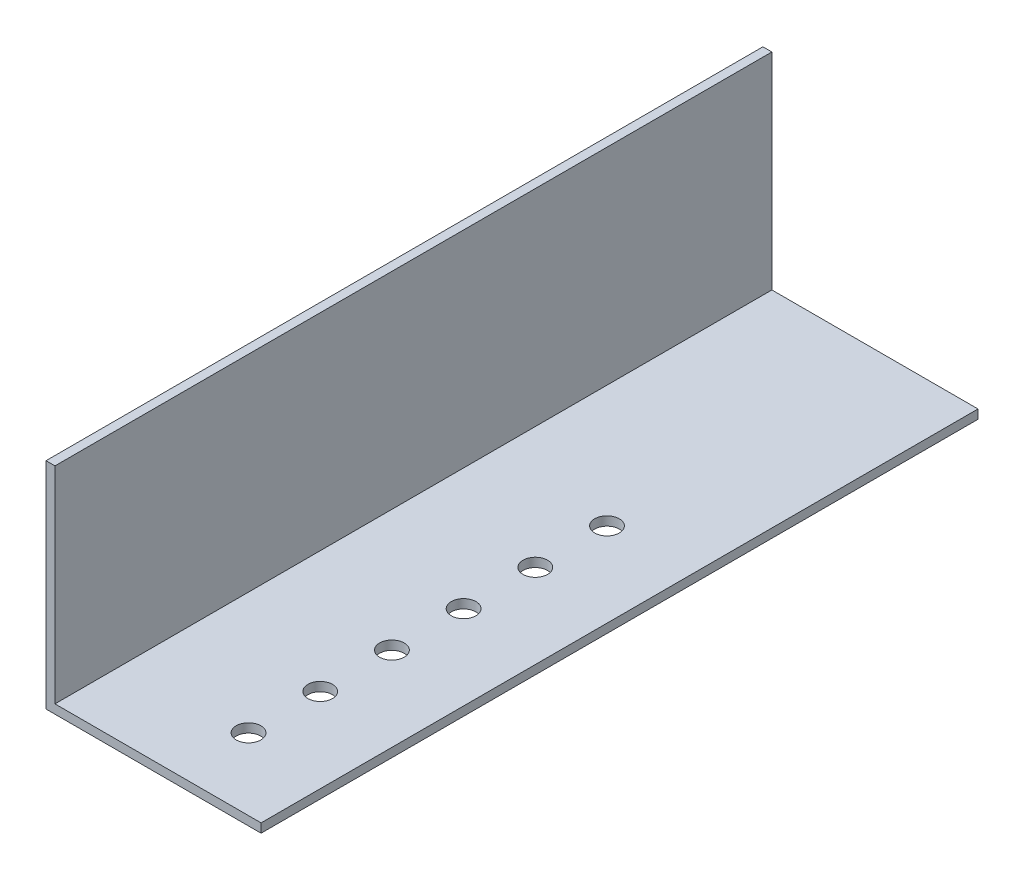
ISO-10303-21;
HEADER;
FILE_DESCRIPTION(('STEP AP214'),'2;1');
FILE_NAME('part.step','',(''),(''),'','','');
FILE_SCHEMA(('AUTOMOTIVE_DESIGN { 1 0 10303 214 1 1 1 1 }'));
ENDSEC;
DATA;
#1=APPLICATION_CONTEXT('core data for automotive mechanical design processes');
#2=APPLICATION_PROTOCOL_DEFINITION('international standard','automotive_design',2000,#1);
#3=PRODUCT_CONTEXT('',#1,'mechanical');
#4=PRODUCT('Part','Part','',(#3));
#5=PRODUCT_RELATED_PRODUCT_CATEGORY('part','',(#4));
#6=PRODUCT_DEFINITION_FORMATION('','',#4);
#7=PRODUCT_DEFINITION_CONTEXT('part definition',#1,'design');
#8=PRODUCT_DEFINITION('design','',#6,#7);
#9=PRODUCT_DEFINITION_SHAPE('','',#8);
#10=(LENGTH_UNIT() NAMED_UNIT(*) SI_UNIT(.MILLI.,.METRE.));
#11=(NAMED_UNIT(*) PLANE_ANGLE_UNIT() SI_UNIT($,.RADIAN.));
#12=(NAMED_UNIT(*) SI_UNIT($,.STERADIAN.) SOLID_ANGLE_UNIT());
#13=UNCERTAINTY_MEASURE_WITH_UNIT(LENGTH_MEASURE(1.E-05),#10,'distance_accuracy_value','');
#14=(GEOMETRIC_REPRESENTATION_CONTEXT(3) GLOBAL_UNCERTAINTY_ASSIGNED_CONTEXT((#13)) GLOBAL_UNIT_ASSIGNED_CONTEXT((#10,
#11,#12)) REPRESENTATION_CONTEXT('',''));
#15=CARTESIAN_POINT('',(0.,0.,0.));
#16=DIRECTION('',(0.,0.,1.));
#17=DIRECTION('',(1.,0.,0.));
#18=AXIS2_PLACEMENT_3D('',#15,#16,#17);
#19=CARTESIAN_POINT('',(38.1,0.,127.));
#20=DIRECTION('',(0.,1.,0.));
#21=DIRECTION('',(-1.,0.,0.));
#22=AXIS2_PLACEMENT_3D('',#19,#20,#21);
#23=PLANE('',#22);
#24=CARTESIAN_POINT('',(23.1775,0.,114.3));
#25=DIRECTION('',(0.,1.,0.));
#26=DIRECTION('',(-1.,0.,0.));
#27=AXIS2_PLACEMENT_3D('',#24,#25,#26);
#28=CIRCLE('',#27,2.18281250000001);
#29=CARTESIAN_POINT('',(20.9946875,0.,114.3));
#30=VERTEX_POINT('',#29);
#31=EDGE_CURVE('E121',#30,#30,#28,.T.);
#32=ORIENTED_EDGE('',*,*,#31,.T.);
#33=EDGE_LOOP('',(#32));
#34=FACE_BOUND('',#33,.T.);
#35=CARTESIAN_POINT('',(23.1775,0.,101.6));
#36=DIRECTION('',(0.,1.,0.));
#37=DIRECTION('',(-1.,0.,0.));
#38=AXIS2_PLACEMENT_3D('',#35,#36,#37);
#39=CIRCLE('',#38,2.18281250000001);
#40=CARTESIAN_POINT('',(20.9946875,0.,101.6));
#41=VERTEX_POINT('',#40);
#42=EDGE_CURVE('E163',#41,#41,#39,.T.);
#43=ORIENTED_EDGE('',*,*,#42,.T.);
#44=EDGE_LOOP('',(#43));
#45=FACE_BOUND('',#44,.T.);
#46=CARTESIAN_POINT('',(23.1775,0.,88.9));
#47=DIRECTION('',(0.,1.,0.));
#48=DIRECTION('',(-1.,0.,0.));
#49=AXIS2_PLACEMENT_3D('',#46,#47,#48);
#50=CIRCLE('',#49,2.18281250000001);
#51=CARTESIAN_POINT('',(20.9946875,0.,88.9));
#52=VERTEX_POINT('',#51);
#53=EDGE_CURVE('E167',#52,#52,#50,.T.);
#54=ORIENTED_EDGE('',*,*,#53,.T.);
#55=EDGE_LOOP('',(#54));
#56=FACE_BOUND('',#55,.T.);
#57=CARTESIAN_POINT('',(23.1775,0.,76.2));
#58=DIRECTION('',(0.,1.,0.));
#59=DIRECTION('',(-1.,0.,0.));
#60=AXIS2_PLACEMENT_3D('',#57,#58,#59);
#61=CIRCLE('',#60,2.18281250000001);
#62=CARTESIAN_POINT('',(20.9946875,0.,76.2));
#63=VERTEX_POINT('',#62);
#64=EDGE_CURVE('E171',#63,#63,#61,.T.);
#65=ORIENTED_EDGE('',*,*,#64,.T.);
#66=EDGE_LOOP('',(#65));
#67=FACE_BOUND('',#66,.T.);
#68=CARTESIAN_POINT('',(23.1775,0.,63.5));
#69=DIRECTION('',(0.,1.,0.));
#70=DIRECTION('',(-1.,0.,0.));
#71=AXIS2_PLACEMENT_3D('',#68,#69,#70);
#72=CIRCLE('',#71,2.18281250000001);
#73=CARTESIAN_POINT('',(20.9946875,0.,63.5));
#74=VERTEX_POINT('',#73);
#75=EDGE_CURVE('E175',#74,#74,#72,.T.);
#76=ORIENTED_EDGE('',*,*,#75,.T.);
#77=EDGE_LOOP('',(#76));
#78=FACE_BOUND('',#77,.T.);
#79=CARTESIAN_POINT('',(23.1775,0.,50.8));
#80=DIRECTION('',(0.,1.,0.));
#81=DIRECTION('',(-1.,0.,0.));
#82=AXIS2_PLACEMENT_3D('',#79,#80,#81);
#83=CIRCLE('',#82,2.1828125);
#84=CARTESIAN_POINT('',(20.9946875,0.,50.8));
#85=VERTEX_POINT('',#84);
#86=EDGE_CURVE('E178',#85,#85,#83,.T.);
#87=ORIENTED_EDGE('',*,*,#86,.T.);
#88=EDGE_LOOP('',(#87));
#89=FACE_BOUND('',#88,.T.);
#90=DIRECTION('',(1.,0.,0.));
#91=VECTOR('',#90,1.);
#92=CARTESIAN_POINT('',(38.1,0.,0.));
#93=LINE('',#92,#91);
#94=CARTESIAN_POINT('',(0.,0.,0.));
#95=VERTEX_POINT('',#94);
#96=CARTESIAN_POINT('',(38.1,0.,0.));
#97=VERTEX_POINT('',#96);
#98=EDGE_CURVE('E117',#95,#97,#93,.T.);
#99=ORIENTED_EDGE('',*,*,#98,.T.);
#100=DIRECTION('',(0.,0.,-1.));
#101=VECTOR('',#100,1.);
#102=CARTESIAN_POINT('',(38.1,0.,127.));
#103=LINE('',#102,#101);
#104=CARTESIAN_POINT('',(38.1,0.,127.));
#105=VERTEX_POINT('',#104);
#106=EDGE_CURVE('E11',#105,#97,#103,.T.);
#107=ORIENTED_EDGE('',*,*,#106,.F.);
#108=DIRECTION('',(1.,0.,0.));
#109=VECTOR('',#108,1.);
#110=CARTESIAN_POINT('',(38.1,0.,127.));
#111=LINE('',#110,#109);
#112=CARTESIAN_POINT('',(0.,0.,127.));
#113=VERTEX_POINT('',#112);
#114=EDGE_CURVE('E128',#113,#105,#111,.T.);
#115=ORIENTED_EDGE('',*,*,#114,.F.);
#116=DIRECTION('',(0.,0.,-1.));
#117=VECTOR('',#116,1.);
#118=CARTESIAN_POINT('',(0.,0.,127.));
#119=LINE('',#118,#117);
#120=EDGE_CURVE('E113',#113,#95,#119,.T.);
#121=ORIENTED_EDGE('',*,*,#120,.T.);
#122=EDGE_LOOP('',(#99,#107,#115,#121));
#123=FACE_BOUND('',#122,.T.);
#124=ADVANCED_FACE('F33',(#34,#45,#56,#67,#78,#89,#123),#23,.F.);
#125=CARTESIAN_POINT('',(38.1,1.5875,127.));
#126=DIRECTION('',(-1.,0.,0.));
#127=DIRECTION('',(0.,0.,1.));
#128=AXIS2_PLACEMENT_3D('',#125,#126,#127);
#129=PLANE('',#128);
#130=DIRECTION('',(0.,1.,0.));
#131=VECTOR('',#130,1.);
#132=CARTESIAN_POINT('',(38.1,1.5875,0.));
#133=LINE('',#132,#131);
#134=CARTESIAN_POINT('',(38.1,1.5875,0.));
#135=VERTEX_POINT('',#134);
#136=EDGE_CURVE('E120',#97,#135,#133,.T.);
#137=ORIENTED_EDGE('',*,*,#136,.T.);
#138=DIRECTION('',(0.,0.,-1.));
#139=VECTOR('',#138,1.);
#140=CARTESIAN_POINT('',(38.1,1.5875,127.));
#141=LINE('',#140,#139);
#142=CARTESIAN_POINT('',(38.1,1.5875,127.));
#143=VERTEX_POINT('',#142);
#144=EDGE_CURVE('E41',#143,#135,#141,.T.);
#145=ORIENTED_EDGE('',*,*,#144,.F.);
#146=DIRECTION('',(0.,1.,0.));
#147=VECTOR('',#146,1.);
#148=CARTESIAN_POINT('',(38.1,1.5875,127.));
#149=LINE('',#148,#147);
#150=EDGE_CURVE('E86',#105,#143,#149,.T.);
#151=ORIENTED_EDGE('',*,*,#150,.F.);
#152=ORIENTED_EDGE('',*,*,#106,.T.);
#153=EDGE_LOOP('',(#137,#145,#151,#152));
#154=FACE_BOUND('',#153,.T.);
#155=ADVANCED_FACE('F152',(#154),#129,.F.);
#156=CARTESIAN_POINT('',(1.5875,1.58749999999999,127.));
#157=DIRECTION('',(0.,-1.,0.));
#158=DIRECTION('',(1.,0.,0.));
#159=AXIS2_PLACEMENT_3D('',#156,#157,#158);
#160=PLANE('',#159);
#161=CARTESIAN_POINT('',(23.1775,1.5875,114.3));
#162=DIRECTION('',(0.,1.,0.));
#163=DIRECTION('',(-1.,0.,0.));
#164=AXIS2_PLACEMENT_3D('',#161,#162,#163);
#165=CIRCLE('',#164,2.18281250000001);
#166=CARTESIAN_POINT('',(20.9946875,1.5875,114.3));
#167=VERTEX_POINT('',#166);
#168=EDGE_CURVE('E180',#167,#167,#165,.T.);
#169=ORIENTED_EDGE('',*,*,#168,.F.);
#170=EDGE_LOOP('',(#169));
#171=FACE_BOUND('',#170,.T.);
#172=CARTESIAN_POINT('',(23.1775,1.5875,101.6));
#173=DIRECTION('',(0.,1.,0.));
#174=DIRECTION('',(-1.,0.,0.));
#175=AXIS2_PLACEMENT_3D('',#172,#173,#174);
#176=CIRCLE('',#175,2.18281250000001);
#177=CARTESIAN_POINT('',(20.9946875,1.5875,101.6));
#178=VERTEX_POINT('',#177);
#179=EDGE_CURVE('E184',#178,#178,#176,.T.);
#180=ORIENTED_EDGE('',*,*,#179,.F.);
#181=EDGE_LOOP('',(#180));
#182=FACE_BOUND('',#181,.T.);
#183=CARTESIAN_POINT('',(23.1775,1.5875,88.9));
#184=DIRECTION('',(0.,1.,0.));
#185=DIRECTION('',(-1.,0.,0.));
#186=AXIS2_PLACEMENT_3D('',#183,#184,#185);
#187=CIRCLE('',#186,2.18281250000001);
#188=CARTESIAN_POINT('',(20.9946875,1.5875,88.9));
#189=VERTEX_POINT('',#188);
#190=EDGE_CURVE('E202',#189,#189,#187,.T.);
#191=ORIENTED_EDGE('',*,*,#190,.F.);
#192=EDGE_LOOP('',(#191));
#193=FACE_BOUND('',#192,.T.);
#194=CARTESIAN_POINT('',(23.1775,1.5875,76.2));
#195=DIRECTION('',(0.,1.,0.));
#196=DIRECTION('',(-1.,0.,0.));
#197=AXIS2_PLACEMENT_3D('',#194,#195,#196);
#198=CIRCLE('',#197,2.18281250000001);
#199=CARTESIAN_POINT('',(20.9946875,1.5875,76.2));
#200=VERTEX_POINT('',#199);
#201=EDGE_CURVE('E199',#200,#200,#198,.T.);
#202=ORIENTED_EDGE('',*,*,#201,.F.);
#203=EDGE_LOOP('',(#202));
#204=FACE_BOUND('',#203,.T.);
#205=CARTESIAN_POINT('',(23.1775,1.5875,63.5));
#206=DIRECTION('',(0.,1.,0.));
#207=DIRECTION('',(-1.,0.,0.));
#208=AXIS2_PLACEMENT_3D('',#205,#206,#207);
#209=CIRCLE('',#208,2.18281250000001);
#210=CARTESIAN_POINT('',(20.9946875,1.5875,63.5));
#211=VERTEX_POINT('',#210);
#212=EDGE_CURVE('E196',#211,#211,#209,.T.);
#213=ORIENTED_EDGE('',*,*,#212,.F.);
#214=EDGE_LOOP('',(#213));
#215=FACE_BOUND('',#214,.T.);
#216=CARTESIAN_POINT('',(23.1775,1.5875,50.8));
#217=DIRECTION('',(0.,1.,0.));
#218=DIRECTION('',(-1.,0.,0.));
#219=AXIS2_PLACEMENT_3D('',#216,#217,#218);
#220=CIRCLE('',#219,2.1828125);
#221=CARTESIAN_POINT('',(20.9946875,1.5875,50.8));
#222=VERTEX_POINT('',#221);
#223=EDGE_CURVE('E187',#222,#222,#220,.T.);
#224=ORIENTED_EDGE('',*,*,#223,.F.);
#225=EDGE_LOOP('',(#224));
#226=FACE_BOUND('',#225,.T.);
#227=DIRECTION('',(-1.,0.,0.));
#228=VECTOR('',#227,1.);
#229=CARTESIAN_POINT('',(1.5875,1.58749999999999,0.));
#230=LINE('',#229,#228);
#231=CARTESIAN_POINT('',(1.5875,1.58749999999999,0.));
#232=VERTEX_POINT('',#231);
#233=EDGE_CURVE('E123',#135,#232,#230,.T.);
#234=ORIENTED_EDGE('',*,*,#233,.T.);
#235=DIRECTION('',(0.,0.,-1.));
#236=VECTOR('',#235,1.);
#237=CARTESIAN_POINT('',(1.5875,1.58749999999999,127.));
#238=LINE('',#237,#236);
#239=CARTESIAN_POINT('',(1.5875,1.58749999999999,127.));
#240=VERTEX_POINT('',#239);
#241=EDGE_CURVE('E108',#240,#232,#238,.T.);
#242=ORIENTED_EDGE('',*,*,#241,.F.);
#243=DIRECTION('',(-1.,0.,0.));
#244=VECTOR('',#243,1.);
#245=CARTESIAN_POINT('',(1.5875,1.58749999999999,127.));
#246=LINE('',#245,#244);
#247=EDGE_CURVE('E99',#143,#240,#246,.T.);
#248=ORIENTED_EDGE('',*,*,#247,.F.);
#249=ORIENTED_EDGE('',*,*,#144,.T.);
#250=EDGE_LOOP('',(#234,#242,#248,#249));
#251=FACE_BOUND('',#250,.T.);
#252=ADVANCED_FACE('F134',(#171,#182,#193,#204,#215,#226,#251),#160,.F.);
#253=CARTESIAN_POINT('',(1.5875,38.1,127.));
#254=DIRECTION('',(-1.,0.,0.));
#255=DIRECTION('',(0.,-1.,0.));
#256=AXIS2_PLACEMENT_3D('',#253,#254,#255);
#257=PLANE('',#256);
#258=DIRECTION('',(0.,1.,0.));
#259=VECTOR('',#258,1.);
#260=CARTESIAN_POINT('',(1.5875,38.1,0.));
#261=LINE('',#260,#259);
#262=CARTESIAN_POINT('',(1.5875,38.1,0.));
#263=VERTEX_POINT('',#262);
#264=EDGE_CURVE('E107',#232,#263,#261,.T.);
#265=ORIENTED_EDGE('',*,*,#264,.T.);
#266=DIRECTION('',(0.,0.,-1.));
#267=VECTOR('',#266,1.);
#268=CARTESIAN_POINT('',(1.5875,38.1,127.));
#269=LINE('',#268,#267);
#270=CARTESIAN_POINT('',(1.5875,38.1,127.));
#271=VERTEX_POINT('',#270);
#272=EDGE_CURVE('E104',#271,#263,#269,.T.);
#273=ORIENTED_EDGE('',*,*,#272,.F.);
#274=DIRECTION('',(0.,1.,0.));
#275=VECTOR('',#274,1.);
#276=CARTESIAN_POINT('',(1.5875,38.1,127.));
#277=LINE('',#276,#275);
#278=EDGE_CURVE('E93',#240,#271,#277,.T.);
#279=ORIENTED_EDGE('',*,*,#278,.F.);
#280=ORIENTED_EDGE('',*,*,#241,.T.);
#281=EDGE_LOOP('',(#265,#273,#279,#280));
#282=FACE_BOUND('',#281,.T.);
#283=ADVANCED_FACE('F105',(#282),#257,.F.);
#284=CARTESIAN_POINT('',(0.,38.1,127.));
#285=DIRECTION('',(0.,-1.,0.));
#286=DIRECTION('',(0.,0.,-1.));
#287=AXIS2_PLACEMENT_3D('',#284,#285,#286);
#288=PLANE('',#287);
#289=DIRECTION('',(-1.,0.,0.));
#290=VECTOR('',#289,1.);
#291=CARTESIAN_POINT('',(0.,38.1,0.));
#292=LINE('',#291,#290);
#293=CARTESIAN_POINT('',(0.,38.1,0.));
#294=VERTEX_POINT('',#293);
#295=EDGE_CURVE('E72',#263,#294,#292,.T.);
#296=ORIENTED_EDGE('',*,*,#295,.T.);
#297=DIRECTION('',(0.,0.,-1.));
#298=VECTOR('',#297,1.);
#299=CARTESIAN_POINT('',(0.,38.1,127.));
#300=LINE('',#299,#298);
#301=CARTESIAN_POINT('',(0.,38.1,127.));
#302=VERTEX_POINT('',#301);
#303=EDGE_CURVE('E109',#302,#294,#300,.T.);
#304=ORIENTED_EDGE('',*,*,#303,.F.);
#305=DIRECTION('',(-1.,0.,0.));
#306=VECTOR('',#305,1.);
#307=CARTESIAN_POINT('',(0.,38.1,127.));
#308=LINE('',#307,#306);
#309=EDGE_CURVE('E97',#271,#302,#308,.T.);
#310=ORIENTED_EDGE('',*,*,#309,.F.);
#311=ORIENTED_EDGE('',*,*,#272,.T.);
#312=EDGE_LOOP('',(#296,#304,#310,#311));
#313=FACE_BOUND('',#312,.T.);
#314=ADVANCED_FACE('F111',(#313),#288,.F.);
#315=CARTESIAN_POINT('',(0.,0.,127.));
#316=DIRECTION('',(1.,0.,0.));
#317=DIRECTION('',(0.,0.,-1.));
#318=AXIS2_PLACEMENT_3D('',#315,#316,#317);
#319=PLANE('',#318);
#320=DIRECTION('',(0.,-1.,0.));
#321=VECTOR('',#320,1.);
#322=CARTESIAN_POINT('',(0.,0.,0.));
#323=LINE('',#322,#321);
#324=EDGE_CURVE('E78',#294,#95,#323,.T.);
#325=ORIENTED_EDGE('',*,*,#324,.T.);
#326=ORIENTED_EDGE('',*,*,#120,.F.);
#327=DIRECTION('',(0.,-1.,0.));
#328=VECTOR('',#327,1.);
#329=CARTESIAN_POINT('',(0.,0.,127.));
#330=LINE('',#329,#328);
#331=EDGE_CURVE('E49',#302,#113,#330,.T.);
#332=ORIENTED_EDGE('',*,*,#331,.F.);
#333=ORIENTED_EDGE('',*,*,#303,.T.);
#334=EDGE_LOOP('',(#325,#326,#332,#333));
#335=FACE_BOUND('',#334,.T.);
#336=ADVANCED_FACE('F141',(#335),#319,.F.);
#337=CARTESIAN_POINT('',(0.,0.,127.));
#338=DIRECTION('',(0.,0.,-1.));
#339=DIRECTION('',(-1.,0.,0.));
#340=AXIS2_PLACEMENT_3D('',#337,#338,#339);
#341=PLANE('',#340);
#342=ORIENTED_EDGE('',*,*,#114,.T.);
#343=ORIENTED_EDGE('',*,*,#150,.T.);
#344=ORIENTED_EDGE('',*,*,#247,.T.);
#345=ORIENTED_EDGE('',*,*,#278,.T.);
#346=ORIENTED_EDGE('',*,*,#309,.T.);
#347=ORIENTED_EDGE('',*,*,#331,.T.);
#348=EDGE_LOOP('',(#342,#343,#344,#345,#346,#347));
#349=FACE_BOUND('',#348,.T.);
#350=ADVANCED_FACE('F95',(#349),#341,.F.);
#351=CARTESIAN_POINT('',(0.,0.,0.));
#352=DIRECTION('',(0.,0.,-1.));
#353=DIRECTION('',(-1.,0.,0.));
#354=AXIS2_PLACEMENT_3D('',#351,#352,#353);
#355=PLANE('',#354);
#356=ORIENTED_EDGE('',*,*,#98,.F.);
#357=ORIENTED_EDGE('',*,*,#324,.F.);
#358=ORIENTED_EDGE('',*,*,#295,.F.);
#359=ORIENTED_EDGE('',*,*,#264,.F.);
#360=ORIENTED_EDGE('',*,*,#233,.F.);
#361=ORIENTED_EDGE('',*,*,#136,.F.);
#362=EDGE_LOOP('',(#356,#357,#358,#359,#360,#361));
#363=FACE_BOUND('',#362,.T.);
#364=ADVANCED_FACE('F137',(#363),#355,.T.);
#365=CARTESIAN_POINT('',(23.1775,-125.4125,50.8));
#366=DIRECTION('',(0.,1.,0.));
#367=DIRECTION('',(-1.,0.,0.));
#368=AXIS2_PLACEMENT_3D('',#365,#366,#367);
#369=CYLINDRICAL_SURFACE('',#368,2.1828125);
#370=ORIENTED_EDGE('',*,*,#223,.T.);
#371=EDGE_LOOP('',(#370));
#372=FACE_BOUND('',#371,.T.);
#373=ORIENTED_EDGE('',*,*,#86,.F.);
#374=EDGE_LOOP('',(#373));
#375=FACE_BOUND('',#374,.T.);
#376=ADVANCED_FACE('F223',(#372,#375),#369,.F.);
#377=CARTESIAN_POINT('',(23.1775,-125.4125,63.5));
#378=DIRECTION('',(0.,1.,0.));
#379=DIRECTION('',(-1.,0.,0.));
#380=AXIS2_PLACEMENT_3D('',#377,#378,#379);
#381=CYLINDRICAL_SURFACE('',#380,2.18281250000001);
#382=ORIENTED_EDGE('',*,*,#212,.T.);
#383=EDGE_LOOP('',(#382));
#384=FACE_BOUND('',#383,.T.);
#385=ORIENTED_EDGE('',*,*,#75,.F.);
#386=EDGE_LOOP('',(#385));
#387=FACE_BOUND('',#386,.T.);
#388=ADVANCED_FACE('F225',(#384,#387),#381,.F.);
#389=CARTESIAN_POINT('',(23.1775,-125.4125,76.2));
#390=DIRECTION('',(0.,1.,0.));
#391=DIRECTION('',(-1.,0.,0.));
#392=AXIS2_PLACEMENT_3D('',#389,#390,#391);
#393=CYLINDRICAL_SURFACE('',#392,2.18281250000001);
#394=ORIENTED_EDGE('',*,*,#201,.T.);
#395=EDGE_LOOP('',(#394));
#396=FACE_BOUND('',#395,.T.);
#397=ORIENTED_EDGE('',*,*,#64,.F.);
#398=EDGE_LOOP('',(#397));
#399=FACE_BOUND('',#398,.T.);
#400=ADVANCED_FACE('F231',(#396,#399),#393,.F.);
#401=CARTESIAN_POINT('',(23.1775,-125.4125,88.9));
#402=DIRECTION('',(0.,1.,0.));
#403=DIRECTION('',(-1.,0.,0.));
#404=AXIS2_PLACEMENT_3D('',#401,#402,#403);
#405=CYLINDRICAL_SURFACE('',#404,2.18281250000001);
#406=ORIENTED_EDGE('',*,*,#190,.T.);
#407=EDGE_LOOP('',(#406));
#408=FACE_BOUND('',#407,.T.);
#409=ORIENTED_EDGE('',*,*,#53,.F.);
#410=EDGE_LOOP('',(#409));
#411=FACE_BOUND('',#410,.T.);
#412=ADVANCED_FACE('F237',(#408,#411),#405,.F.);
#413=CARTESIAN_POINT('',(23.1775,-125.4125,101.6));
#414=DIRECTION('',(0.,1.,0.));
#415=DIRECTION('',(-1.,0.,0.));
#416=AXIS2_PLACEMENT_3D('',#413,#414,#415);
#417=CYLINDRICAL_SURFACE('',#416,2.18281250000001);
#418=ORIENTED_EDGE('',*,*,#179,.T.);
#419=EDGE_LOOP('',(#418));
#420=FACE_BOUND('',#419,.T.);
#421=ORIENTED_EDGE('',*,*,#42,.F.);
#422=EDGE_LOOP('',(#421));
#423=FACE_BOUND('',#422,.T.);
#424=ADVANCED_FACE('F208',(#420,#423),#417,.F.);
#425=CARTESIAN_POINT('',(23.1775,-125.4125,114.3));
#426=DIRECTION('',(0.,1.,0.));
#427=DIRECTION('',(-1.,0.,0.));
#428=AXIS2_PLACEMENT_3D('',#425,#426,#427);
#429=CYLINDRICAL_SURFACE('',#428,2.18281250000001);
#430=ORIENTED_EDGE('',*,*,#168,.T.);
#431=EDGE_LOOP('',(#430));
#432=FACE_BOUND('',#431,.T.);
#433=ORIENTED_EDGE('',*,*,#31,.F.);
#434=EDGE_LOOP('',(#433));
#435=FACE_BOUND('',#434,.T.);
#436=ADVANCED_FACE('F244',(#432,#435),#429,.F.);
#437=CLOSED_SHELL('',(#124,#155,#252,#283,#314,#336,#350,#364,#376,#388,#400,#412,#424,#436));
#438=MANIFOLD_SOLID_BREP('B2',#437);
#439=ADVANCED_BREP_SHAPE_REPRESENTATION('',(#18,#438),#14);
#440=SHAPE_DEFINITION_REPRESENTATION(#9,#439);
ENDSEC;
END-ISO-10303-21;
